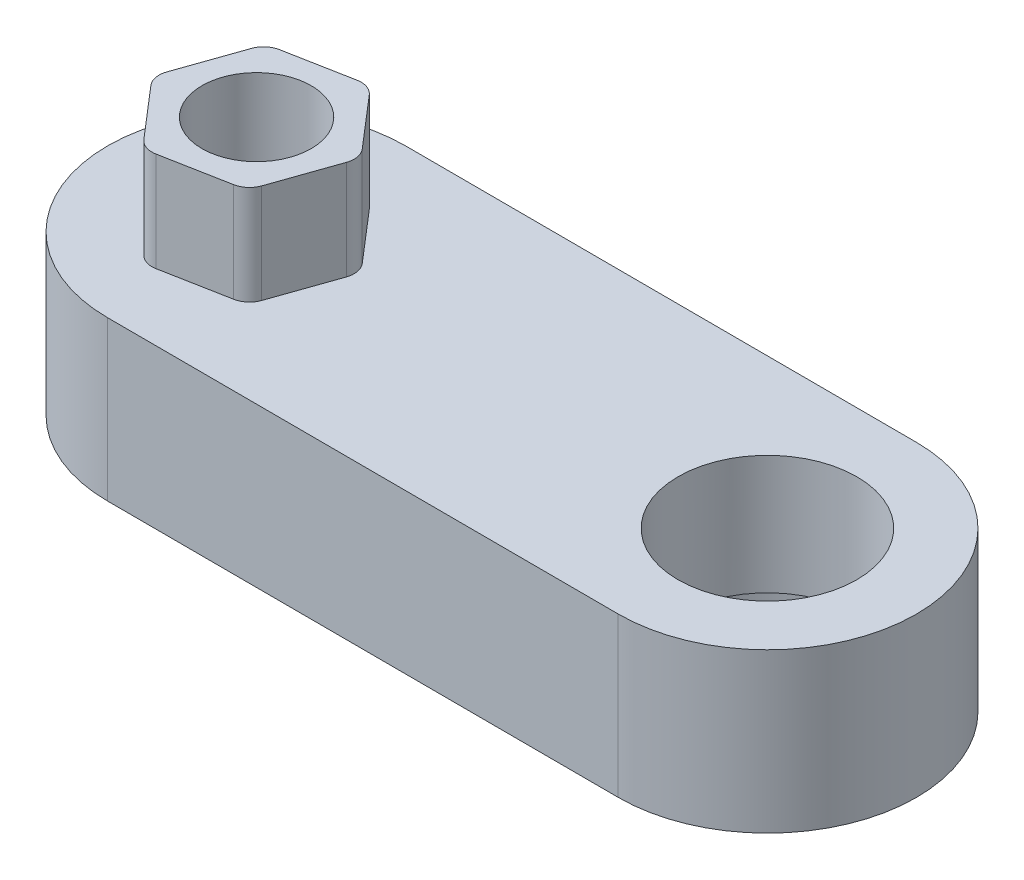
ISO-10303-21;
HEADER;
FILE_DESCRIPTION(('STEP AP214'),'2;1');
FILE_NAME('part.step','',(''),(''),'','','');
FILE_SCHEMA(('AUTOMOTIVE_DESIGN { 1 0 10303 214 1 1 1 1 }'));
ENDSEC;
DATA;
#1=APPLICATION_CONTEXT('core data for automotive mechanical design processes');
#2=APPLICATION_PROTOCOL_DEFINITION('international standard','automotive_design',2000,#1);
#3=PRODUCT_CONTEXT('',#1,'mechanical');
#4=PRODUCT('Part','Part','',(#3));
#5=PRODUCT_RELATED_PRODUCT_CATEGORY('part','',(#4));
#6=PRODUCT_DEFINITION_FORMATION('','',#4);
#7=PRODUCT_DEFINITION_CONTEXT('part definition',#1,'design');
#8=PRODUCT_DEFINITION('design','',#6,#7);
#9=PRODUCT_DEFINITION_SHAPE('','',#8);
#10=(LENGTH_UNIT() NAMED_UNIT(*) SI_UNIT(.MILLI.,.METRE.));
#11=(NAMED_UNIT(*) PLANE_ANGLE_UNIT() SI_UNIT($,.RADIAN.));
#12=(NAMED_UNIT(*) SI_UNIT($,.STERADIAN.) SOLID_ANGLE_UNIT());
#13=UNCERTAINTY_MEASURE_WITH_UNIT(LENGTH_MEASURE(1.E-05),#10,'distance_accuracy_value','');
#14=(GEOMETRIC_REPRESENTATION_CONTEXT(3) GLOBAL_UNCERTAINTY_ASSIGNED_CONTEXT((#13)) GLOBAL_UNIT_ASSIGNED_CONTEXT((#10,
#11,#12)) REPRESENTATION_CONTEXT('',''));
#15=CARTESIAN_POINT('',(0.,0.,0.));
#16=DIRECTION('',(0.,0.,1.));
#17=DIRECTION('',(1.,0.,0.));
#18=AXIS2_PLACEMENT_3D('',#15,#16,#17);
#19=CARTESIAN_POINT('',(-1.76310548074214,0.,-3.41650348242183));
#20=DIRECTION('',(0.,1.,0.));
#21=DIRECTION('',(0.,0.,1.));
#22=AXIS2_PLACEMENT_3D('',#19,#20,#21);
#23=CYLINDRICAL_SURFACE('',#22,2.75);
#24=CARTESIAN_POINT('',(-1.76310548074214,13.,-3.41650348242183));
#25=DIRECTION('',(0.,1.,0.));
#26=DIRECTION('',(0.,0.,1.));
#27=AXIS2_PLACEMENT_3D('',#24,#25,#26);
#28=CIRCLE('',#27,2.75);
#29=CARTESIAN_POINT('',(-1.76310548074214,13.,-0.666503482421826));
#30=VERTEX_POINT('',#29);
#31=EDGE_CURVE('E325',#30,#30,#28,.T.);
#32=ORIENTED_EDGE('',*,*,#31,.T.);
#33=EDGE_LOOP('',(#32));
#34=FACE_BOUND('',#33,.T.);
#35=CARTESIAN_POINT('',(-1.76310548074214,3.,-3.41650348242183));
#36=DIRECTION('',(0.,-1.,0.));
#37=DIRECTION('',(0.,0.,-1.));
#38=AXIS2_PLACEMENT_3D('',#35,#36,#37);
#39=CIRCLE('',#38,2.75);
#40=CARTESIAN_POINT('',(-1.76310548074214,3.,-6.16650348242183));
#41=VERTEX_POINT('',#40);
#42=EDGE_CURVE('E37',#41,#41,#39,.F.);
#43=ORIENTED_EDGE('',*,*,#42,.F.);
#44=EDGE_LOOP('',(#43));
#45=FACE_BOUND('',#44,.T.);
#46=ADVANCED_FACE('F33',(#34,#45),#23,.F.);
#47=CARTESIAN_POINT('',(24.0348577490154,8.,-3.35037386801913));
#48=DIRECTION('',(0.,1.,0.));
#49=DIRECTION('',(0.,0.,1.));
#50=AXIS2_PLACEMENT_3D('',#47,#48,#49);
#51=PLANE('',#50);
#52=CARTESIAN_POINT('',(24.0348577490154,8.,-3.35037386801913));
#53=DIRECTION('',(0.,1.,0.));
#54=DIRECTION('',(0.,0.,1.));
#55=AXIS2_PLACEMENT_3D('',#52,#53,#54);
#56=CIRCLE('',#55,4.5);
#57=CARTESIAN_POINT('',(24.0348577490154,8.,1.14962613198087));
#58=VERTEX_POINT('',#57);
#59=EDGE_CURVE('E756',#58,#58,#56,.T.);
#60=ORIENTED_EDGE('',*,*,#59,.F.);
#61=EDGE_LOOP('',(#60));
#62=FACE_BOUND('',#61,.T.);
#63=CARTESIAN_POINT('',(24.0348577490154,8.,-3.35037386801913));
#64=DIRECTION('',(0.,1.,0.));
#65=DIRECTION('',(0.,0.,1.));
#66=AXIS2_PLACEMENT_3D('',#63,#64,#65);
#67=CIRCLE('',#66,7.5);
#68=CARTESIAN_POINT('',(24.0156325693323,8.,4.1496014914381));
#69=VERTEX_POINT('',#68);
#70=CARTESIAN_POINT('',(24.0540829286985,8.,-10.8503492274764));
#71=VERTEX_POINT('',#70);
#72=EDGE_CURVE('E364',#69,#71,#67,.T.);
#73=ORIENTED_EDGE('',*,*,#72,.T.);
#74=DIRECTION('',(-0.999996714594302,0.,-0.00256335729108146));
#75=VECTOR('',#74,1.);
#76=CARTESIAN_POINT('',(24.0540829286985,8.,-10.8503492274764));
#77=LINE('',#76,#75);
#78=CARTESIAN_POINT('',(-1.74388030105903,8.,-10.9164788418791));
#79=VERTEX_POINT('',#78);
#80=EDGE_CURVE('E367',#71,#79,#77,.T.);
#81=ORIENTED_EDGE('',*,*,#80,.T.);
#82=CARTESIAN_POINT('',(-1.76310548074214,8.,-3.41650348242183));
#83=DIRECTION('',(0.,1.,0.));
#84=DIRECTION('',(0.,0.,1.));
#85=AXIS2_PLACEMENT_3D('',#82,#83,#84);
#86=CIRCLE('',#85,7.5);
#87=CARTESIAN_POINT('',(-1.78233066042525,8.,4.08347187703544));
#88=VERTEX_POINT('',#87);
#89=EDGE_CURVE('E370',#79,#88,#86,.T.);
#90=ORIENTED_EDGE('',*,*,#89,.T.);
#91=DIRECTION('',(0.999996714594302,0.,0.00256335729108162));
#92=VECTOR('',#91,1.);
#93=CARTESIAN_POINT('',(24.0156325693323,8.,4.1496014914381));
#94=LINE('',#93,#92);
#95=EDGE_CURVE('E372',#88,#69,#94,.T.);
#96=ORIENTED_EDGE('',*,*,#95,.T.);
#97=EDGE_LOOP('',(#73,#81,#90,#96));
#98=FACE_BOUND('',#97,.T.);
#99=DIRECTION('',(0.98262288242802,0.,-0.185613229401487));
#100=VECTOR('',#99,1.);
#101=CARTESIAN_POINT('',(-3.25175247023499,8.,0.833664766091873));
#102=LINE('',#101,#100);
#103=CARTESIAN_POINT('',(-2.68443488455328,8.,0.726500918131768));
#104=VERTEX_POINT('',#103);
#105=CARTESIAN_POINT('',(0.606007112400627,8.,0.104950599963159));
#106=VERTEX_POINT('',#105);
#107=EDGE_CURVE('E351',#104,#106,#102,.T.);
#108=ORIENTED_EDGE('',*,*,#107,.F.);
#109=CARTESIAN_POINT('',(-2.87004811395477,8.,-0.256121964296252));
#110=DIRECTION('',(0.,1.,0.));
#111=DIRECTION('',(0.,0.,1.));
#112=AXIS2_PLACEMENT_3D('',#109,#110,#111);
#113=CIRCLE('',#112,1.);
#114=CARTESIAN_POINT('',(-3.62821787777658,8.,0.39593524885791));
#115=VERTEX_POINT('',#114);
#116=EDGE_CURVE('E42',#104,#115,#113,.F.);
#117=ORIENTED_EDGE('',*,*,#116,.T.);
#118=DIRECTION('',(0.652057213154162,0.,0.758169763821816));
#119=VECTOR('',#118,1.);
#120=CARTESIAN_POINT('',(-6.18818264905945,8.,-2.58062546833306));
#121=LINE('',#120,#119);
#122=CARTESIAN_POINT('',(-5.81171724151786,8.,-2.1428959510991));
#123=VERTEX_POINT('',#122);
#124=EDGE_CURVE('E328',#123,#115,#121,.T.);
#125=ORIENTED_EDGE('',*,*,#124,.F.);
#126=CARTESIAN_POINT('',(-5.05354747769604,8.,-2.79495316425326));
#127=DIRECTION('',(0.,1.,0.));
#128=DIRECTION('',(0.,0.,1.));
#129=AXIS2_PLACEMENT_3D('',#126,#127,#128);
#130=CIRCLE('',#129,1.);
#131=CARTESIAN_POINT('',(-5.99733047091934,8.,-3.12551883352712));
#132=VERTEX_POINT('',#131);
#133=EDGE_CURVE('E441',#123,#132,#130,.F.);
#134=ORIENTED_EDGE('',*,*,#133,.T.);
#135=DIRECTION('',(-0.330565669273856,0.,0.943782993223298));
#136=VECTOR('',#135,1.);
#137=CARTESIAN_POINT('',(-4.6995356595666,8.,-6.83079371684673));
#138=LINE('',#137,#136);
#139=CARTESIAN_POINT('',(-4.89038783770671,8.,-6.28590035165267));
#140=VERTEX_POINT('',#139);
#141=EDGE_CURVE('E333',#140,#132,#138,.T.);
#142=ORIENTED_EDGE('',*,*,#141,.F.);
#143=CARTESIAN_POINT('',(-3.94660484448341,8.,-5.95533468237882));
#144=DIRECTION('',(0.,1.,0.));
#145=DIRECTION('',(0.,0.,1.));
#146=AXIS2_PLACEMENT_3D('',#143,#144,#145);
#147=CIRCLE('',#146,1.);
#148=CARTESIAN_POINT('',(-4.13221807388489,8.,-6.93795756480684));
#149=VERTEX_POINT('',#148);
#150=EDGE_CURVE('E435',#140,#149,#147,.F.);
#151=ORIENTED_EDGE('',*,*,#150,.T.);
#152=DIRECTION('',(-0.982622882428021,0.,0.185613229401483));
#153=VECTOR('',#152,1.);
#154=CARTESIAN_POINT('',(-0.274458491249265,8.,-7.66667173093554));
#155=LINE('',#154,#153);
#156=CARTESIAN_POINT('',(-0.841776076930966,8.,-7.55950788297544));
#157=VERTEX_POINT('',#156);
#158=EDGE_CURVE('E359',#157,#149,#155,.T.);
#159=ORIENTED_EDGE('',*,*,#158,.F.);
#160=CARTESIAN_POINT('',(-0.656162847529482,8.,-6.57688500054742));
#161=DIRECTION('',(0.,1.,0.));
#162=DIRECTION('',(0.,0.,1.));
#163=AXIS2_PLACEMENT_3D('',#160,#161,#162);
#164=CIRCLE('',#163,1.);
#165=CARTESIAN_POINT('',(0.102006916292328,8.,-7.22894221370158));
#166=VERTEX_POINT('',#165);
#167=EDGE_CURVE('E437',#157,#166,#164,.F.);
#168=ORIENTED_EDGE('',*,*,#167,.T.);
#169=DIRECTION('',(-0.652057213154167,0.,-0.758169763821811));
#170=VECTOR('',#169,1.);
#171=CARTESIAN_POINT('',(2.66197168757519,8.,-4.25238149651066));
#172=LINE('',#171,#170);
#173=CARTESIAN_POINT('',(2.2855062800336,8.,-4.69011101374462));
#174=VERTEX_POINT('',#173);
#175=EDGE_CURVE('E356',#174,#166,#172,.T.);
#176=ORIENTED_EDGE('',*,*,#175,.F.);
#177=CARTESIAN_POINT('',(1.52733651621178,8.,-4.03805380059045));
#178=DIRECTION('',(0.,1.,0.));
#179=DIRECTION('',(0.,0.,1.));
#180=AXIS2_PLACEMENT_3D('',#177,#178,#179);
#181=CIRCLE('',#180,1.);
#182=CARTESIAN_POINT('',(2.47111950943508,8.,-3.70748813131659));
#183=VERTEX_POINT('',#182);
#184=EDGE_CURVE('E439',#174,#183,#181,.F.);
#185=ORIENTED_EDGE('',*,*,#184,.T.);
#186=DIRECTION('',(0.330565669273855,0.,-0.943782993223298));
#187=VECTOR('',#186,1.);
#188=CARTESIAN_POINT('',(1.17332469808233,8.,-0.00221324799694478));
#189=LINE('',#188,#187);
#190=CARTESIAN_POINT('',(1.36417687622244,8.,-0.547106613191006));
#191=VERTEX_POINT('',#190);
#192=EDGE_CURVE('E353',#191,#183,#189,.T.);
#193=ORIENTED_EDGE('',*,*,#192,.F.);
#194=CARTESIAN_POINT('',(0.420393882999141,8.,-0.877672282464861));
#195=DIRECTION('',(0.,1.,0.));
#196=DIRECTION('',(0.,0.,1.));
#197=AXIS2_PLACEMENT_3D('',#194,#195,#196);
#198=CIRCLE('',#197,1.);
#199=EDGE_CURVE('E11',#191,#106,#198,.F.);
#200=ORIENTED_EDGE('',*,*,#199,.T.);
#201=EDGE_LOOP('',(#108,#117,#125,#134,#142,#151,#159,#168,#176,#185,#193,#200));
#202=FACE_BOUND('',#201,.T.);
#203=ADVANCED_FACE('F444',(#62,#98,#202),#51,.T.);
#204=CARTESIAN_POINT('',(24.0348577490154,8.,-3.35037386801913));
#205=DIRECTION('',(0.,-1.,0.));
#206=DIRECTION('',(0.,0.,-1.));
#207=AXIS2_PLACEMENT_3D('',#204,#205,#206);
#208=CYLINDRICAL_SURFACE('',#207,7.5);
#209=CARTESIAN_POINT('',(24.0348577490154,0.,-3.35037386801913));
#210=DIRECTION('',(0.,1.,0.));
#211=DIRECTION('',(0.,0.,1.));
#212=AXIS2_PLACEMENT_3D('',#209,#210,#211);
#213=CIRCLE('',#212,7.5);
#214=CARTESIAN_POINT('',(24.0156325693323,0.,4.1496014914381));
#215=VERTEX_POINT('',#214);
#216=CARTESIAN_POINT('',(24.0540829286985,0.,-10.8503492274764));
#217=VERTEX_POINT('',#216);
#218=EDGE_CURVE('E348',#215,#217,#213,.T.);
#219=ORIENTED_EDGE('',*,*,#218,.T.);
#220=DIRECTION('',(0.,-1.,0.));
#221=VECTOR('',#220,1.);
#222=CARTESIAN_POINT('',(24.0540829286985,8.,-10.8503492274764));
#223=LINE('',#222,#221);
#224=EDGE_CURVE('E390',#71,#217,#223,.T.);
#225=ORIENTED_EDGE('',*,*,#224,.F.);
#226=ORIENTED_EDGE('',*,*,#72,.F.);
#227=DIRECTION('',(0.,-1.,0.));
#228=VECTOR('',#227,1.);
#229=CARTESIAN_POINT('',(24.0156325693323,8.,4.1496014914381));
#230=LINE('',#229,#228);
#231=EDGE_CURVE('E374',#69,#215,#230,.T.);
#232=ORIENTED_EDGE('',*,*,#231,.T.);
#233=EDGE_LOOP('',(#219,#225,#226,#232));
#234=FACE_BOUND('',#233,.T.);
#235=ADVANCED_FACE('F510',(#234),#208,.T.);
#236=CARTESIAN_POINT('',(24.0540829286985,8.,-10.8503492274764));
#237=DIRECTION('',(-0.00256335729108146,0.,0.999996714594302));
#238=DIRECTION('',(0.999996714594302,0.,0.00256335729108146));
#239=AXIS2_PLACEMENT_3D('',#236,#237,#238);
#240=PLANE('',#239);
#241=DIRECTION('',(-0.999996714594302,0.,-0.00256335729108146));
#242=VECTOR('',#241,1.);
#243=CARTESIAN_POINT('',(24.0540829286985,0.,-10.8503492274764));
#244=LINE('',#243,#242);
#245=CARTESIAN_POINT('',(-1.74388030105903,0.,-10.9164788418791));
#246=VERTEX_POINT('',#245);
#247=EDGE_CURVE('E377',#217,#246,#244,.T.);
#248=ORIENTED_EDGE('',*,*,#247,.T.);
#249=DIRECTION('',(0.,-1.,0.));
#250=VECTOR('',#249,1.);
#251=CARTESIAN_POINT('',(-1.74388030105903,8.,-10.9164788418791));
#252=LINE('',#251,#250);
#253=EDGE_CURVE('E387',#79,#246,#252,.T.);
#254=ORIENTED_EDGE('',*,*,#253,.F.);
#255=ORIENTED_EDGE('',*,*,#80,.F.);
#256=ORIENTED_EDGE('',*,*,#224,.T.);
#257=EDGE_LOOP('',(#248,#254,#255,#256));
#258=FACE_BOUND('',#257,.T.);
#259=ADVANCED_FACE('F543',(#258),#240,.F.);
#260=CARTESIAN_POINT('',(-1.76310548074214,8.,-3.41650348242183));
#261=DIRECTION('',(0.,-1.,0.));
#262=DIRECTION('',(0.,0.,-1.));
#263=AXIS2_PLACEMENT_3D('',#260,#261,#262);
#264=CYLINDRICAL_SURFACE('',#263,7.5);
#265=CARTESIAN_POINT('',(-1.76310548074214,0.,-3.41650348242183));
#266=DIRECTION('',(0.,1.,0.));
#267=DIRECTION('',(0.,0.,1.));
#268=AXIS2_PLACEMENT_3D('',#265,#266,#267);
#269=CIRCLE('',#268,7.5);
#270=CARTESIAN_POINT('',(-1.78233066042525,0.,4.08347187703544));
#271=VERTEX_POINT('',#270);
#272=EDGE_CURVE('E379',#246,#271,#269,.T.);
#273=ORIENTED_EDGE('',*,*,#272,.T.);
#274=DIRECTION('',(0.,-1.,0.));
#275=VECTOR('',#274,1.);
#276=CARTESIAN_POINT('',(-1.78233066042525,8.,4.08347187703544));
#277=LINE('',#276,#275);
#278=EDGE_CURVE('E384',#88,#271,#277,.T.);
#279=ORIENTED_EDGE('',*,*,#278,.F.);
#280=ORIENTED_EDGE('',*,*,#89,.F.);
#281=ORIENTED_EDGE('',*,*,#253,.T.);
#282=EDGE_LOOP('',(#273,#279,#280,#281));
#283=FACE_BOUND('',#282,.T.);
#284=ADVANCED_FACE('F539',(#283),#264,.T.);
#285=CARTESIAN_POINT('',(24.0156325693323,8.,4.1496014914381));
#286=DIRECTION('',(0.00256335729108163,0.,-0.999996714594302));
#287=DIRECTION('',(-0.999996714594302,0.,-0.00256335729108163));
#288=AXIS2_PLACEMENT_3D('',#285,#286,#287);
#289=PLANE('',#288);
#290=DIRECTION('',(0.999996714594302,0.,0.00256335729108162));
#291=VECTOR('',#290,1.);
#292=CARTESIAN_POINT('',(24.0156325693323,0.,4.1496014914381));
#293=LINE('',#292,#291);
#294=EDGE_CURVE('E368',#271,#215,#293,.T.);
#295=ORIENTED_EDGE('',*,*,#294,.T.);
#296=ORIENTED_EDGE('',*,*,#231,.F.);
#297=ORIENTED_EDGE('',*,*,#95,.F.);
#298=ORIENTED_EDGE('',*,*,#278,.T.);
#299=EDGE_LOOP('',(#295,#296,#297,#298));
#300=FACE_BOUND('',#299,.T.);
#301=ADVANCED_FACE('F535',(#300),#289,.F.);
#302=CARTESIAN_POINT('',(24.0348577490154,0.,-3.35037386801913));
#303=DIRECTION('',(0.,1.,0.));
#304=DIRECTION('',(0.,0.,1.));
#305=AXIS2_PLACEMENT_3D('',#302,#303,#304);
#306=PLANE('',#305);
#307=CARTESIAN_POINT('',(24.0348577490154,0.,-3.35037386801913));
#308=DIRECTION('',(0.,-1.,0.));
#309=DIRECTION('',(0.,0.,-1.));
#310=AXIS2_PLACEMENT_3D('',#307,#308,#309);
#311=CIRCLE('',#310,6.59999999999999);
#312=CARTESIAN_POINT('',(24.0348577490154,0.,-9.95037386801913));
#313=VERTEX_POINT('',#312);
#314=EDGE_CURVE('E246',#313,#313,#311,.T.);
#315=ORIENTED_EDGE('',*,*,#314,.F.);
#316=EDGE_LOOP('',(#315));
#317=FACE_BOUND('',#316,.T.);
#318=DIRECTION('',(-0.98262288242802,0.,0.185613229401487));
#319=VECTOR('',#318,1.);
#320=CARTESIAN_POINT('',(0.698813727101371,0.,0.596262041177169));
#321=LINE('',#320,#319);
#322=CARTESIAN_POINT('',(0.698813727101372,0.,0.59626204117717));
#323=VERTEX_POINT('',#322);
#324=CARTESIAN_POINT('',(-2.59162826985254,0.,1.21781235934578));
#325=VERTEX_POINT('',#324);
#326=EDGE_CURVE('E275',#323,#325,#321,.T.);
#327=ORIENTED_EDGE('',*,*,#326,.F.);
#328=CARTESIAN_POINT('',(0.420393882999141,0.,-0.877672282464861));
#329=DIRECTION('',(0.,-1.,0.));
#330=DIRECTION('',(0.,0.,-1.));
#331=AXIS2_PLACEMENT_3D('',#328,#329,#330);
#332=CIRCLE('',#331,1.5);
#333=CARTESIAN_POINT('',(1.83606837283409,0.,-0.381823778554079));
#334=VERTEX_POINT('',#333);
#335=EDGE_CURVE('E49',#334,#323,#332,.T.);
#336=ORIENTED_EDGE('',*,*,#335,.F.);
#337=DIRECTION('',(-0.330565669273855,0.,0.943782993223298));
#338=VECTOR('',#337,1.);
#339=CARTESIAN_POINT('',(2.94301100604673,0.,-3.54220529667967));
#340=LINE('',#339,#338);
#341=CARTESIAN_POINT('',(2.94301100604673,0.,-3.54220529667967));
#342=VERTEX_POINT('',#341);
#343=EDGE_CURVE('E240',#342,#334,#340,.T.);
#344=ORIENTED_EDGE('',*,*,#343,.F.);
#345=CARTESIAN_POINT('',(1.52733651621178,0.,-4.03805380059045));
#346=DIRECTION('',(0.,-1.,0.));
#347=DIRECTION('',(0.,0.,-1.));
#348=AXIS2_PLACEMENT_3D('',#345,#346,#347);
#349=CIRCLE('',#348,1.5);
#350=CARTESIAN_POINT('',(2.6645911619445,0.,-5.0161396203217));
#351=VERTEX_POINT('',#350);
#352=EDGE_CURVE('E243',#351,#342,#349,.T.);
#353=ORIENTED_EDGE('',*,*,#352,.F.);
#354=DIRECTION('',(0.652057213154167,0.,0.758169763821811));
#355=VECTOR('',#354,1.);
#356=CARTESIAN_POINT('',(0.481091798203234,0.,-7.55497082027867));
#357=LINE('',#356,#355);
#358=CARTESIAN_POINT('',(0.481091798203234,0.,-7.55497082027867));
#359=VERTEX_POINT('',#358);
#360=EDGE_CURVE('E299',#359,#351,#357,.T.);
#361=ORIENTED_EDGE('',*,*,#360,.F.);
#362=CARTESIAN_POINT('',(-0.656162847529482,0.,-6.57688500054742));
#363=DIRECTION('',(0.,-1.,0.));
#364=DIRECTION('',(0.,0.,-1.));
#365=AXIS2_PLACEMENT_3D('',#362,#363,#364);
#366=CIRCLE('',#365,1.5);
#367=CARTESIAN_POINT('',(-0.934582691631707,0.,-8.05081932418945));
#368=VERTEX_POINT('',#367);
#369=EDGE_CURVE('E296',#368,#359,#366,.T.);
#370=ORIENTED_EDGE('',*,*,#369,.F.);
#371=DIRECTION('',(0.982622882428021,0.,-0.185613229401483));
#372=VECTOR('',#371,1.);
#373=CARTESIAN_POINT('',(-4.22502468858564,0.,-7.42926900602085));
#374=LINE('',#373,#372);
#375=CARTESIAN_POINT('',(-4.22502468858564,0.,-7.42926900602085));
#376=VERTEX_POINT('',#375);
#377=EDGE_CURVE('E293',#376,#368,#374,.T.);
#378=ORIENTED_EDGE('',*,*,#377,.F.);
#379=CARTESIAN_POINT('',(-3.94660484448341,0.,-5.95533468237882));
#380=DIRECTION('',(0.,-1.,0.));
#381=DIRECTION('',(0.,0.,-1.));
#382=AXIS2_PLACEMENT_3D('',#379,#380,#381);
#383=CIRCLE('',#382,1.5);
#384=CARTESIAN_POINT('',(-5.36227933431836,0.,-6.4511831862896));
#385=VERTEX_POINT('',#384);
#386=EDGE_CURVE('E290',#385,#376,#383,.T.);
#387=ORIENTED_EDGE('',*,*,#386,.F.);
#388=DIRECTION('',(0.330565669273856,0.,-0.943782993223298));
#389=VECTOR('',#388,1.);
#390=CARTESIAN_POINT('',(-6.46922196753099,0.,-3.29080166816405));
#391=LINE('',#390,#389);
#392=CARTESIAN_POINT('',(-6.46922196753099,0.,-3.29080166816405));
#393=VERTEX_POINT('',#392);
#394=EDGE_CURVE('E287',#393,#385,#391,.T.);
#395=ORIENTED_EDGE('',*,*,#394,.F.);
#396=CARTESIAN_POINT('',(-5.05354747769604,0.,-2.79495316425326));
#397=DIRECTION('',(0.,-1.,0.));
#398=DIRECTION('',(0.,0.,-1.));
#399=AXIS2_PLACEMENT_3D('',#396,#397,#398);
#400=CIRCLE('',#399,1.5);
#401=CARTESIAN_POINT('',(-6.19080212342877,0.,-1.81686734452202));
#402=VERTEX_POINT('',#401);
#403=EDGE_CURVE('E284',#402,#393,#400,.T.);
#404=ORIENTED_EDGE('',*,*,#403,.F.);
#405=DIRECTION('',(-0.652057213154162,0.,-0.758169763821816));
#406=VECTOR('',#405,1.);
#407=CARTESIAN_POINT('',(-4.00730275968749,0.,0.72196385543499));
#408=LINE('',#407,#406);
#409=CARTESIAN_POINT('',(-4.00730275968749,0.,0.72196385543499));
#410=VERTEX_POINT('',#409);
#411=EDGE_CURVE('E281',#410,#402,#408,.T.);
#412=ORIENTED_EDGE('',*,*,#411,.F.);
#413=CARTESIAN_POINT('',(-2.87004811395477,0.,-0.256121964296252));
#414=DIRECTION('',(0.,-1.,0.));
#415=DIRECTION('',(0.,0.,-1.));
#416=AXIS2_PLACEMENT_3D('',#413,#414,#415);
#417=CIRCLE('',#416,1.5);
#418=EDGE_CURVE('E278',#325,#410,#417,.T.);
#419=ORIENTED_EDGE('',*,*,#418,.F.);
#420=EDGE_LOOP('',(#327,#336,#344,#353,#361,#370,#378,#387,#395,#404,#412,#419));
#421=FACE_BOUND('',#420,.T.);
#422=ORIENTED_EDGE('',*,*,#218,.F.);
#423=ORIENTED_EDGE('',*,*,#294,.F.);
#424=ORIENTED_EDGE('',*,*,#272,.F.);
#425=ORIENTED_EDGE('',*,*,#247,.F.);
#426=EDGE_LOOP('',(#422,#423,#424,#425));
#427=FACE_BOUND('',#426,.T.);
#428=ADVANCED_FACE('F531',(#317,#421,#427),#306,.F.);
#429=CARTESIAN_POINT('',(-6.18818264905945,13.,-2.58062546833306));
#430=DIRECTION('',(0.758169763821816,0.,-0.652057213154162));
#431=DIRECTION('',(-0.652057213154162,0.,-0.758169763821816));
#432=AXIS2_PLACEMENT_3D('',#429,#430,#431);
#433=PLANE('',#432);
#434=DIRECTION('',(0.652057213154162,0.,0.758169763821816));
#435=VECTOR('',#434,1.);
#436=CARTESIAN_POINT('',(-6.18818264905945,13.,-2.58062546833306));
#437=LINE('',#436,#435);
#438=CARTESIAN_POINT('',(-5.81171724151786,13.,-2.1428959510991));
#439=VERTEX_POINT('',#438);
#440=CARTESIAN_POINT('',(-3.62821787777658,13.,0.39593524885791));
#441=VERTEX_POINT('',#440);
#442=EDGE_CURVE('E329',#439,#441,#437,.T.);
#443=ORIENTED_EDGE('',*,*,#442,.F.);
#444=DIRECTION('',(0.,-1.,0.));
#445=VECTOR('',#444,1.);
#446=CARTESIAN_POINT('',(-5.81171724151786,13.,-2.1428959510991));
#447=LINE('',#446,#445);
#448=EDGE_CURVE('E427',#439,#123,#447,.T.);
#449=ORIENTED_EDGE('',*,*,#448,.T.);
#450=ORIENTED_EDGE('',*,*,#124,.T.);
#451=DIRECTION('',(0.,-1.,0.));
#452=VECTOR('',#451,1.);
#453=CARTESIAN_POINT('',(-3.62821787777658,13.,0.39593524885791));
#454=LINE('',#453,#452);
#455=EDGE_CURVE('E425',#115,#441,#454,.F.);
#456=ORIENTED_EDGE('',*,*,#455,.T.);
#457=EDGE_LOOP('',(#443,#449,#450,#456));
#458=FACE_BOUND('',#457,.T.);
#459=ADVANCED_FACE('F450',(#458),#433,.F.);
#460=CARTESIAN_POINT('',(-3.25175247023499,13.,0.833664766091873));
#461=DIRECTION('',(-0.185613229401487,0.,-0.98262288242802));
#462=DIRECTION('',(-0.98262288242802,0.,0.185613229401487));
#463=AXIS2_PLACEMENT_3D('',#460,#461,#462);
#464=PLANE('',#463);
#465=DIRECTION('',(0.98262288242802,0.,-0.185613229401487));
#466=VECTOR('',#465,1.);
#467=CARTESIAN_POINT('',(-3.25175247023499,13.,0.833664766091873));
#468=LINE('',#467,#466);
#469=CARTESIAN_POINT('',(-2.68443488455328,13.,0.726500918131768));
#470=VERTEX_POINT('',#469);
#471=CARTESIAN_POINT('',(0.606007112400627,13.,0.104950599963159));
#472=VERTEX_POINT('',#471);
#473=EDGE_CURVE('E332',#470,#472,#468,.T.);
#474=ORIENTED_EDGE('',*,*,#473,.F.);
#475=DIRECTION('',(0.,-1.,0.));
#476=VECTOR('',#475,1.);
#477=CARTESIAN_POINT('',(-2.68443488455328,13.,0.726500918131768));
#478=LINE('',#477,#476);
#479=EDGE_CURVE('E432',#470,#104,#478,.T.);
#480=ORIENTED_EDGE('',*,*,#479,.T.);
#481=ORIENTED_EDGE('',*,*,#107,.T.);
#482=DIRECTION('',(0.,-1.,0.));
#483=VECTOR('',#482,1.);
#484=CARTESIAN_POINT('',(0.606007112400627,13.,0.104950599963159));
#485=LINE('',#484,#483);
#486=EDGE_CURVE('E430',#106,#472,#485,.F.);
#487=ORIENTED_EDGE('',*,*,#486,.T.);
#488=EDGE_LOOP('',(#474,#480,#481,#487));
#489=FACE_BOUND('',#488,.T.);
#490=ADVANCED_FACE('F459',(#489),#464,.F.);
#491=CARTESIAN_POINT('',(1.17332469808233,13.,-0.00221324799694478));
#492=DIRECTION('',(-0.943782993223298,0.,-0.330565669273855));
#493=DIRECTION('',(-0.330565669273855,0.,0.943782993223298));
#494=AXIS2_PLACEMENT_3D('',#491,#492,#493);
#495=PLANE('',#494);
#496=ORIENTED_EDGE('',*,*,#192,.T.);
#497=DIRECTION('',(0.,-1.,0.));
#498=VECTOR('',#497,1.);
#499=CARTESIAN_POINT('',(2.47111950943508,13.,-3.70748813131659));
#500=LINE('',#499,#498);
#501=CARTESIAN_POINT('',(2.47111950943508,13.,-3.70748813131659));
#502=VERTEX_POINT('',#501);
#503=EDGE_CURVE('E423',#183,#502,#500,.F.);
#504=ORIENTED_EDGE('',*,*,#503,.T.);
#505=DIRECTION('',(0.330565669273855,0.,-0.943782993223298));
#506=VECTOR('',#505,1.);
#507=CARTESIAN_POINT('',(1.17332469808233,13.,-0.00221324799694478));
#508=LINE('',#507,#506);
#509=CARTESIAN_POINT('',(1.36417687622244,13.,-0.547106613191006));
#510=VERTEX_POINT('',#509);
#511=EDGE_CURVE('E336',#510,#502,#508,.T.);
#512=ORIENTED_EDGE('',*,*,#511,.F.);
#513=DIRECTION('',(0.,-1.,0.));
#514=VECTOR('',#513,1.);
#515=CARTESIAN_POINT('',(1.36417687622244,13.,-0.547106613191006));
#516=LINE('',#515,#514);
#517=EDGE_CURVE('E420',#510,#191,#516,.T.);
#518=ORIENTED_EDGE('',*,*,#517,.T.);
#519=EDGE_LOOP('',(#496,#504,#512,#518));
#520=FACE_BOUND('',#519,.T.);
#521=ADVANCED_FACE('F466',(#520),#495,.F.);
#522=CARTESIAN_POINT('',(2.66197168757519,13.,-4.25238149651066));
#523=DIRECTION('',(-0.758169763821811,0.,0.652057213154167));
#524=DIRECTION('',(0.652057213154167,0.,0.758169763821811));
#525=AXIS2_PLACEMENT_3D('',#522,#523,#524);
#526=PLANE('',#525);
#527=ORIENTED_EDGE('',*,*,#175,.T.);
#528=DIRECTION('',(0.,-1.,0.));
#529=VECTOR('',#528,1.);
#530=CARTESIAN_POINT('',(0.102006916292329,13.,-7.22894221370158));
#531=LINE('',#530,#529);
#532=CARTESIAN_POINT('',(0.102006916292328,13.,-7.22894221370158));
#533=VERTEX_POINT('',#532);
#534=EDGE_CURVE('E418',#166,#533,#531,.F.);
#535=ORIENTED_EDGE('',*,*,#534,.T.);
#536=DIRECTION('',(-0.652057213154167,0.,-0.758169763821811));
#537=VECTOR('',#536,1.);
#538=CARTESIAN_POINT('',(2.66197168757519,13.,-4.25238149651066));
#539=LINE('',#538,#537);
#540=CARTESIAN_POINT('',(2.2855062800336,13.,-4.69011101374462));
#541=VERTEX_POINT('',#540);
#542=EDGE_CURVE('E339',#541,#533,#539,.T.);
#543=ORIENTED_EDGE('',*,*,#542,.F.);
#544=DIRECTION('',(0.,-1.,0.));
#545=VECTOR('',#544,1.);
#546=CARTESIAN_POINT('',(2.2855062800336,13.,-4.69011101374462));
#547=LINE('',#546,#545);
#548=EDGE_CURVE('E415',#541,#174,#547,.T.);
#549=ORIENTED_EDGE('',*,*,#548,.T.);
#550=EDGE_LOOP('',(#527,#535,#543,#549));
#551=FACE_BOUND('',#550,.T.);
#552=ADVANCED_FACE('F474',(#551),#526,.F.);
#553=CARTESIAN_POINT('',(-0.274458491249265,13.,-7.66667173093554));
#554=DIRECTION('',(0.185613229401483,0.,0.982622882428021));
#555=DIRECTION('',(0.982622882428021,0.,-0.185613229401483));
#556=AXIS2_PLACEMENT_3D('',#553,#554,#555);
#557=PLANE('',#556);
#558=ORIENTED_EDGE('',*,*,#158,.T.);
#559=DIRECTION('',(0.,-1.,0.));
#560=VECTOR('',#559,1.);
#561=CARTESIAN_POINT('',(-4.13221807388489,13.,-6.93795756480684));
#562=LINE('',#561,#560);
#563=CARTESIAN_POINT('',(-4.13221807388489,13.,-6.93795756480684));
#564=VERTEX_POINT('',#563);
#565=EDGE_CURVE('E401',#149,#564,#562,.F.);
#566=ORIENTED_EDGE('',*,*,#565,.T.);
#567=DIRECTION('',(-0.982622882428021,0.,0.185613229401483));
#568=VECTOR('',#567,1.);
#569=CARTESIAN_POINT('',(-0.274458491249265,13.,-7.66667173093554));
#570=LINE('',#569,#568);
#571=CARTESIAN_POINT('',(-0.841776076930966,13.,-7.55950788297544));
#572=VERTEX_POINT('',#571);
#573=EDGE_CURVE('E342',#572,#564,#570,.T.);
#574=ORIENTED_EDGE('',*,*,#573,.F.);
#575=DIRECTION('',(0.,-1.,0.));
#576=VECTOR('',#575,1.);
#577=CARTESIAN_POINT('',(-0.841776076930966,13.,-7.55950788297544));
#578=LINE('',#577,#576);
#579=EDGE_CURVE('E398',#572,#157,#578,.T.);
#580=ORIENTED_EDGE('',*,*,#579,.T.);
#581=EDGE_LOOP('',(#558,#566,#574,#580));
#582=FACE_BOUND('',#581,.T.);
#583=ADVANCED_FACE('F483',(#582),#557,.F.);
#584=CARTESIAN_POINT('',(-4.6995356595666,13.,-6.83079371684673));
#585=DIRECTION('',(0.943782993223298,0.,0.330565669273856));
#586=DIRECTION('',(0.330565669273856,0.,-0.943782993223298));
#587=AXIS2_PLACEMENT_3D('',#584,#585,#586);
#588=PLANE('',#587);
#589=DIRECTION('',(-0.330565669273856,0.,0.943782993223298));
#590=VECTOR('',#589,1.);
#591=CARTESIAN_POINT('',(-4.6995356595666,13.,-6.83079371684673));
#592=LINE('',#591,#590);
#593=CARTESIAN_POINT('',(-4.89038783770671,13.,-6.28590035165267));
#594=VERTEX_POINT('',#593);
#595=CARTESIAN_POINT('',(-5.99733047091934,13.,-3.12551883352712));
#596=VERTEX_POINT('',#595);
#597=EDGE_CURVE('E345',#594,#596,#592,.T.);
#598=ORIENTED_EDGE('',*,*,#597,.F.);
#599=DIRECTION('',(0.,-1.,0.));
#600=VECTOR('',#599,1.);
#601=CARTESIAN_POINT('',(-4.89038783770671,13.,-6.28590035165267));
#602=LINE('',#601,#600);
#603=EDGE_CURVE('E395',#594,#140,#602,.T.);
#604=ORIENTED_EDGE('',*,*,#603,.T.);
#605=ORIENTED_EDGE('',*,*,#141,.T.);
#606=DIRECTION('',(0.,-1.,0.));
#607=VECTOR('',#606,1.);
#608=CARTESIAN_POINT('',(-5.99733047091934,13.,-3.12551883352712));
#609=LINE('',#608,#607);
#610=EDGE_CURVE('E393',#132,#596,#609,.F.);
#611=ORIENTED_EDGE('',*,*,#610,.T.);
#612=EDGE_LOOP('',(#598,#604,#605,#611));
#613=FACE_BOUND('',#612,.T.);
#614=ADVANCED_FACE('F492',(#613),#588,.F.);
#615=CARTESIAN_POINT('',(0.,13.,0.));
#616=DIRECTION('',(0.,1.,0.));
#617=DIRECTION('',(0.,0.,1.));
#618=AXIS2_PLACEMENT_3D('',#615,#616,#617);
#619=PLANE('',#618);
#620=ORIENTED_EDGE('',*,*,#31,.F.);
#621=EDGE_LOOP('',(#620));
#622=FACE_BOUND('',#621,.T.);
#623=ORIENTED_EDGE('',*,*,#573,.T.);
#624=CARTESIAN_POINT('',(-3.94660484448341,13.,-5.95533468237882));
#625=DIRECTION('',(0.,1.,0.));
#626=DIRECTION('',(0.,0.,1.));
#627=AXIS2_PLACEMENT_3D('',#624,#625,#626);
#628=CIRCLE('',#627,1.);
#629=EDGE_CURVE('E413',#564,#594,#628,.T.);
#630=ORIENTED_EDGE('',*,*,#629,.T.);
#631=ORIENTED_EDGE('',*,*,#597,.T.);
#632=CARTESIAN_POINT('',(-5.05354747769604,13.,-2.79495316425326));
#633=DIRECTION('',(0.,1.,0.));
#634=DIRECTION('',(0.,0.,1.));
#635=AXIS2_PLACEMENT_3D('',#632,#633,#634);
#636=CIRCLE('',#635,1.);
#637=EDGE_CURVE('E407',#596,#439,#636,.T.);
#638=ORIENTED_EDGE('',*,*,#637,.T.);
#639=ORIENTED_EDGE('',*,*,#442,.T.);
#640=CARTESIAN_POINT('',(-2.87004811395477,13.,-0.256121964296252));
#641=DIRECTION('',(0.,1.,0.));
#642=DIRECTION('',(0.,0.,1.));
#643=AXIS2_PLACEMENT_3D('',#640,#641,#642);
#644=CIRCLE('',#643,1.);
#645=EDGE_CURVE('E405',#441,#470,#644,.T.);
#646=ORIENTED_EDGE('',*,*,#645,.T.);
#647=ORIENTED_EDGE('',*,*,#473,.T.);
#648=CARTESIAN_POINT('',(0.420393882999141,13.,-0.877672282464861));
#649=DIRECTION('',(0.,1.,0.));
#650=DIRECTION('',(0.,0.,1.));
#651=AXIS2_PLACEMENT_3D('',#648,#649,#650);
#652=CIRCLE('',#651,1.);
#653=EDGE_CURVE('E403',#472,#510,#652,.T.);
#654=ORIENTED_EDGE('',*,*,#653,.T.);
#655=ORIENTED_EDGE('',*,*,#511,.T.);
#656=CARTESIAN_POINT('',(1.52733651621178,13.,-4.03805380059045));
#657=DIRECTION('',(0.,1.,0.));
#658=DIRECTION('',(0.,0.,1.));
#659=AXIS2_PLACEMENT_3D('',#656,#657,#658);
#660=CIRCLE('',#659,1.);
#661=EDGE_CURVE('E409',#502,#541,#660,.T.);
#662=ORIENTED_EDGE('',*,*,#661,.T.);
#663=ORIENTED_EDGE('',*,*,#542,.T.);
#664=CARTESIAN_POINT('',(-0.656162847529482,13.,-6.57688500054742));
#665=DIRECTION('',(0.,1.,0.));
#666=DIRECTION('',(0.,0.,1.));
#667=AXIS2_PLACEMENT_3D('',#664,#665,#666);
#668=CIRCLE('',#667,1.);
#669=EDGE_CURVE('E411',#533,#572,#668,.T.);
#670=ORIENTED_EDGE('',*,*,#669,.T.);
#671=EDGE_LOOP('',(#623,#630,#631,#638,#639,#646,#647,#654,#655,#662,#663,#670));
#672=FACE_BOUND('',#671,.T.);
#673=ADVANCED_FACE('F456',(#622,#672),#619,.T.);
#674=CARTESIAN_POINT('',(-3.94660484448341,13.,-5.95533468237882));
#675=DIRECTION('',(0.,-1.,0.));
#676=DIRECTION('',(0.,0.,-1.));
#677=AXIS2_PLACEMENT_3D('',#674,#675,#676);
#678=CYLINDRICAL_SURFACE('',#677,1.);
#679=ORIENTED_EDGE('',*,*,#629,.F.);
#680=ORIENTED_EDGE('',*,*,#565,.F.);
#681=ORIENTED_EDGE('',*,*,#150,.F.);
#682=ORIENTED_EDGE('',*,*,#603,.F.);
#683=EDGE_LOOP('',(#679,#680,#681,#682));
#684=FACE_BOUND('',#683,.T.);
#685=ADVANCED_FACE('F487',(#684),#678,.T.);
#686=CARTESIAN_POINT('',(-0.656162847529482,13.,-6.57688500054742));
#687=DIRECTION('',(0.,-1.,0.));
#688=DIRECTION('',(0.,0.,-1.));
#689=AXIS2_PLACEMENT_3D('',#686,#687,#688);
#690=CYLINDRICAL_SURFACE('',#689,1.);
#691=ORIENTED_EDGE('',*,*,#669,.F.);
#692=ORIENTED_EDGE('',*,*,#534,.F.);
#693=ORIENTED_EDGE('',*,*,#167,.F.);
#694=ORIENTED_EDGE('',*,*,#579,.F.);
#695=EDGE_LOOP('',(#691,#692,#693,#694));
#696=FACE_BOUND('',#695,.T.);
#697=ADVANCED_FACE('F478',(#696),#690,.T.);
#698=CARTESIAN_POINT('',(1.52733651621178,13.,-4.03805380059045));
#699=DIRECTION('',(0.,-1.,0.));
#700=DIRECTION('',(0.,0.,-1.));
#701=AXIS2_PLACEMENT_3D('',#698,#699,#700);
#702=CYLINDRICAL_SURFACE('',#701,1.);
#703=ORIENTED_EDGE('',*,*,#661,.F.);
#704=ORIENTED_EDGE('',*,*,#503,.F.);
#705=ORIENTED_EDGE('',*,*,#184,.F.);
#706=ORIENTED_EDGE('',*,*,#548,.F.);
#707=EDGE_LOOP('',(#703,#704,#705,#706));
#708=FACE_BOUND('',#707,.T.);
#709=ADVANCED_FACE('F469',(#708),#702,.T.);
#710=CARTESIAN_POINT('',(-5.05354747769604,13.,-2.79495316425326));
#711=DIRECTION('',(0.,-1.,0.));
#712=DIRECTION('',(0.,0.,-1.));
#713=AXIS2_PLACEMENT_3D('',#710,#711,#712);
#714=CYLINDRICAL_SURFACE('',#713,1.);
#715=ORIENTED_EDGE('',*,*,#637,.F.);
#716=ORIENTED_EDGE('',*,*,#610,.F.);
#717=ORIENTED_EDGE('',*,*,#133,.F.);
#718=ORIENTED_EDGE('',*,*,#448,.F.);
#719=EDGE_LOOP('',(#715,#716,#717,#718));
#720=FACE_BOUND('',#719,.T.);
#721=ADVANCED_FACE('F496',(#720),#714,.T.);
#722=CARTESIAN_POINT('',(-2.87004811395477,13.,-0.256121964296252));
#723=DIRECTION('',(0.,-1.,0.));
#724=DIRECTION('',(0.,0.,-1.));
#725=AXIS2_PLACEMENT_3D('',#722,#723,#724);
#726=CYLINDRICAL_SURFACE('',#725,1.);
#727=ORIENTED_EDGE('',*,*,#645,.F.);
#728=ORIENTED_EDGE('',*,*,#455,.F.);
#729=ORIENTED_EDGE('',*,*,#116,.F.);
#730=ORIENTED_EDGE('',*,*,#479,.F.);
#731=EDGE_LOOP('',(#727,#728,#729,#730));
#732=FACE_BOUND('',#731,.T.);
#733=ADVANCED_FACE('F453',(#732),#726,.T.);
#734=CARTESIAN_POINT('',(0.420393882999141,13.,-0.877672282464861));
#735=DIRECTION('',(0.,-1.,0.));
#736=DIRECTION('',(0.,0.,-1.));
#737=AXIS2_PLACEMENT_3D('',#734,#735,#736);
#738=CYLINDRICAL_SURFACE('',#737,1.);
#739=ORIENTED_EDGE('',*,*,#653,.F.);
#740=ORIENTED_EDGE('',*,*,#486,.F.);
#741=ORIENTED_EDGE('',*,*,#199,.F.);
#742=ORIENTED_EDGE('',*,*,#517,.F.);
#743=EDGE_LOOP('',(#739,#740,#741,#742));
#744=FACE_BOUND('',#743,.T.);
#745=ADVANCED_FACE('F35',(#744),#738,.T.);
#746=CARTESIAN_POINT('',(0.420393882999141,3.,-0.877672282464861));
#747=DIRECTION('',(0.,-1.,0.));
#748=DIRECTION('',(0.,0.,-1.));
#749=AXIS2_PLACEMENT_3D('',#746,#747,#748);
#750=PLANE('',#749);
#751=CARTESIAN_POINT('',(0.420393882999141,3.,-0.877672282464861));
#752=DIRECTION('',(0.,-1.,0.));
#753=DIRECTION('',(0.,0.,-1.));
#754=AXIS2_PLACEMENT_3D('',#751,#752,#753);
#755=CIRCLE('',#754,1.5);
#756=CARTESIAN_POINT('',(1.83606837283409,3.,-0.381823778554079));
#757=VERTEX_POINT('',#756);
#758=CARTESIAN_POINT('',(0.698813727101371,3.,0.596262041177169));
#759=VERTEX_POINT('',#758);
#760=EDGE_CURVE('E220',#757,#759,#755,.T.);
#761=ORIENTED_EDGE('',*,*,#760,.T.);
#762=DIRECTION('',(-0.98262288242802,0.,0.185613229401487));
#763=VECTOR('',#762,1.);
#764=CARTESIAN_POINT('',(0.698813727101371,3.,0.596262041177169));
#765=LINE('',#764,#763);
#766=CARTESIAN_POINT('',(-2.59162826985254,3.,1.21781235934578));
#767=VERTEX_POINT('',#766);
#768=EDGE_CURVE('E229',#759,#767,#765,.T.);
#769=ORIENTED_EDGE('',*,*,#768,.T.);
#770=CARTESIAN_POINT('',(-2.87004811395477,3.,-0.256121964296252));
#771=DIRECTION('',(0.,-1.,0.));
#772=DIRECTION('',(0.,0.,-1.));
#773=AXIS2_PLACEMENT_3D('',#770,#771,#772);
#774=CIRCLE('',#773,1.5);
#775=CARTESIAN_POINT('',(-4.00730275968749,3.,0.72196385543499));
#776=VERTEX_POINT('',#775);
#777=EDGE_CURVE('E234',#767,#776,#774,.T.);
#778=ORIENTED_EDGE('',*,*,#777,.T.);
#779=DIRECTION('',(-0.652057213154162,0.,-0.758169763821816));
#780=VECTOR('',#779,1.);
#781=CARTESIAN_POINT('',(-4.00730275968749,3.,0.72196385543499));
#782=LINE('',#781,#780);
#783=CARTESIAN_POINT('',(-6.19080212342877,3.,-1.81686734452202));
#784=VERTEX_POINT('',#783);
#785=EDGE_CURVE('E250',#776,#784,#782,.T.);
#786=ORIENTED_EDGE('',*,*,#785,.T.);
#787=CARTESIAN_POINT('',(-5.05354747769604,3.,-2.79495316425326));
#788=DIRECTION('',(0.,-1.,0.));
#789=DIRECTION('',(0.,0.,-1.));
#790=AXIS2_PLACEMENT_3D('',#787,#788,#789);
#791=CIRCLE('',#790,1.5);
#792=CARTESIAN_POINT('',(-6.46922196753099,3.,-3.29080166816405));
#793=VERTEX_POINT('',#792);
#794=EDGE_CURVE('E253',#784,#793,#791,.T.);
#795=ORIENTED_EDGE('',*,*,#794,.T.);
#796=DIRECTION('',(0.330565669273856,0.,-0.943782993223298));
#797=VECTOR('',#796,1.);
#798=CARTESIAN_POINT('',(-6.46922196753099,3.,-3.29080166816405));
#799=LINE('',#798,#797);
#800=CARTESIAN_POINT('',(-5.36227933431836,3.,-6.4511831862896));
#801=VERTEX_POINT('',#800);
#802=EDGE_CURVE('E256',#793,#801,#799,.T.);
#803=ORIENTED_EDGE('',*,*,#802,.T.);
#804=CARTESIAN_POINT('',(-3.94660484448341,3.,-5.95533468237882));
#805=DIRECTION('',(0.,-1.,0.));
#806=DIRECTION('',(0.,0.,-1.));
#807=AXIS2_PLACEMENT_3D('',#804,#805,#806);
#808=CIRCLE('',#807,1.5);
#809=CARTESIAN_POINT('',(-4.22502468858564,3.,-7.42926900602085));
#810=VERTEX_POINT('',#809);
#811=EDGE_CURVE('E259',#801,#810,#808,.T.);
#812=ORIENTED_EDGE('',*,*,#811,.T.);
#813=DIRECTION('',(0.982622882428021,0.,-0.185613229401483));
#814=VECTOR('',#813,1.);
#815=CARTESIAN_POINT('',(-4.22502468858564,3.,-7.42926900602085));
#816=LINE('',#815,#814);
#817=CARTESIAN_POINT('',(-0.934582691631707,3.,-8.05081932418945));
#818=VERTEX_POINT('',#817);
#819=EDGE_CURVE('E262',#810,#818,#816,.T.);
#820=ORIENTED_EDGE('',*,*,#819,.T.);
#821=CARTESIAN_POINT('',(-0.656162847529482,3.,-6.57688500054742));
#822=DIRECTION('',(0.,-1.,0.));
#823=DIRECTION('',(0.,0.,-1.));
#824=AXIS2_PLACEMENT_3D('',#821,#822,#823);
#825=CIRCLE('',#824,1.5);
#826=CARTESIAN_POINT('',(0.481091798203234,3.,-7.55497082027867));
#827=VERTEX_POINT('',#826);
#828=EDGE_CURVE('E265',#818,#827,#825,.T.);
#829=ORIENTED_EDGE('',*,*,#828,.T.);
#830=DIRECTION('',(0.652057213154167,0.,0.758169763821811));
#831=VECTOR('',#830,1.);
#832=CARTESIAN_POINT('',(0.481091798203234,3.,-7.55497082027867));
#833=LINE('',#832,#831);
#834=CARTESIAN_POINT('',(2.6645911619445,3.,-5.0161396203217));
#835=VERTEX_POINT('',#834);
#836=EDGE_CURVE('E268',#827,#835,#833,.T.);
#837=ORIENTED_EDGE('',*,*,#836,.T.);
#838=CARTESIAN_POINT('',(1.52733651621178,3.,-4.03805380059045));
#839=DIRECTION('',(0.,-1.,0.));
#840=DIRECTION('',(0.,0.,-1.));
#841=AXIS2_PLACEMENT_3D('',#838,#839,#840);
#842=CIRCLE('',#841,1.5);
#843=CARTESIAN_POINT('',(2.94301100604673,3.,-3.54220529667967));
#844=VERTEX_POINT('',#843);
#845=EDGE_CURVE('E271',#835,#844,#842,.T.);
#846=ORIENTED_EDGE('',*,*,#845,.T.);
#847=DIRECTION('',(-0.330565669273855,0.,0.943782993223298));
#848=VECTOR('',#847,1.);
#849=CARTESIAN_POINT('',(2.94301100604673,3.,-3.54220529667967));
#850=LINE('',#849,#848);
#851=EDGE_CURVE('E226',#844,#757,#850,.T.);
#852=ORIENTED_EDGE('',*,*,#851,.T.);
#853=EDGE_LOOP('',(#761,#769,#778,#786,#795,#803,#812,#820,#829,#837,#846,#852));
#854=FACE_BOUND('',#853,.T.);
#855=ORIENTED_EDGE('',*,*,#42,.T.);
#856=EDGE_LOOP('',(#855));
#857=FACE_BOUND('',#856,.T.);
#858=ADVANCED_FACE('F236',(#854,#857),#750,.T.);
#859=CARTESIAN_POINT('',(0.420393882999141,3.,-0.877672282464861));
#860=DIRECTION('',(0.,-1.,0.));
#861=DIRECTION('',(0.,0.,-1.));
#862=AXIS2_PLACEMENT_3D('',#859,#860,#861);
#863=CYLINDRICAL_SURFACE('',#862,1.5);
#864=ORIENTED_EDGE('',*,*,#335,.T.);
#865=DIRECTION('',(0.,-1.,0.));
#866=VECTOR('',#865,1.);
#867=CARTESIAN_POINT('',(0.698813727101371,3.,0.596262041177169));
#868=LINE('',#867,#866);
#869=EDGE_CURVE('E216',#759,#323,#868,.T.);
#870=ORIENTED_EDGE('',*,*,#869,.F.);
#871=ORIENTED_EDGE('',*,*,#760,.F.);
#872=DIRECTION('',(0.,-1.,0.));
#873=VECTOR('',#872,1.);
#874=CARTESIAN_POINT('',(1.83606837283409,3.,-0.381823778554079));
#875=LINE('',#874,#873);
#876=EDGE_CURVE('E304',#757,#334,#875,.T.);
#877=ORIENTED_EDGE('',*,*,#876,.T.);
#878=EDGE_LOOP('',(#864,#870,#871,#877));
#879=FACE_BOUND('',#878,.T.);
#880=ADVANCED_FACE('F218',(#879),#863,.F.);
#881=CARTESIAN_POINT('',(2.94301100604673,3.,-3.54220529667967));
#882=DIRECTION('',(0.943782993223298,0.,0.330565669273855));
#883=DIRECTION('',(0.330565669273855,0.,-0.943782993223298));
#884=AXIS2_PLACEMENT_3D('',#881,#882,#883);
#885=PLANE('',#884);
#886=ORIENTED_EDGE('',*,*,#343,.T.);
#887=ORIENTED_EDGE('',*,*,#876,.F.);
#888=ORIENTED_EDGE('',*,*,#851,.F.);
#889=DIRECTION('',(0.,-1.,0.));
#890=VECTOR('',#889,1.);
#891=CARTESIAN_POINT('',(2.94301100604673,3.,-3.54220529667967));
#892=LINE('',#891,#890);
#893=EDGE_CURVE('E306',#844,#342,#892,.T.);
#894=ORIENTED_EDGE('',*,*,#893,.T.);
#895=EDGE_LOOP('',(#886,#887,#888,#894));
#896=FACE_BOUND('',#895,.T.);
#897=ADVANCED_FACE('F600',(#896),#885,.F.);
#898=CARTESIAN_POINT('',(1.52733651621178,3.,-4.03805380059045));
#899=DIRECTION('',(0.,-1.,0.));
#900=DIRECTION('',(0.,0.,-1.));
#901=AXIS2_PLACEMENT_3D('',#898,#899,#900);
#902=CYLINDRICAL_SURFACE('',#901,1.5);
#903=ORIENTED_EDGE('',*,*,#352,.T.);
#904=ORIENTED_EDGE('',*,*,#893,.F.);
#905=ORIENTED_EDGE('',*,*,#845,.F.);
#906=DIRECTION('',(0.,-1.,0.));
#907=VECTOR('',#906,1.);
#908=CARTESIAN_POINT('',(2.6645911619445,3.,-5.0161396203217));
#909=LINE('',#908,#907);
#910=EDGE_CURVE('E308',#835,#351,#909,.T.);
#911=ORIENTED_EDGE('',*,*,#910,.T.);
#912=EDGE_LOOP('',(#903,#904,#905,#911));
#913=FACE_BOUND('',#912,.T.);
#914=ADVANCED_FACE('F608',(#913),#902,.F.);
#915=CARTESIAN_POINT('',(0.481091798203234,3.,-7.55497082027867));
#916=DIRECTION('',(0.758169763821811,0.,-0.652057213154167));
#917=DIRECTION('',(-0.652057213154167,0.,-0.758169763821811));
#918=AXIS2_PLACEMENT_3D('',#915,#916,#917);
#919=PLANE('',#918);
#920=ORIENTED_EDGE('',*,*,#360,.T.);
#921=ORIENTED_EDGE('',*,*,#910,.F.);
#922=ORIENTED_EDGE('',*,*,#836,.F.);
#923=DIRECTION('',(0.,-1.,0.));
#924=VECTOR('',#923,1.);
#925=CARTESIAN_POINT('',(0.481091798203234,3.,-7.55497082027867));
#926=LINE('',#925,#924);
#927=EDGE_CURVE('E310',#827,#359,#926,.T.);
#928=ORIENTED_EDGE('',*,*,#927,.T.);
#929=EDGE_LOOP('',(#920,#921,#922,#928));
#930=FACE_BOUND('',#929,.T.);
#931=ADVANCED_FACE('F618',(#930),#919,.F.);
#932=CARTESIAN_POINT('',(-0.656162847529482,3.,-6.57688500054742));
#933=DIRECTION('',(0.,-1.,0.));
#934=DIRECTION('',(0.,0.,-1.));
#935=AXIS2_PLACEMENT_3D('',#932,#933,#934);
#936=CYLINDRICAL_SURFACE('',#935,1.5);
#937=ORIENTED_EDGE('',*,*,#369,.T.);
#938=ORIENTED_EDGE('',*,*,#927,.F.);
#939=ORIENTED_EDGE('',*,*,#828,.F.);
#940=DIRECTION('',(0.,-1.,0.));
#941=VECTOR('',#940,1.);
#942=CARTESIAN_POINT('',(-0.934582691631707,3.,-8.05081932418945));
#943=LINE('',#942,#941);
#944=EDGE_CURVE('E312',#818,#368,#943,.T.);
#945=ORIENTED_EDGE('',*,*,#944,.T.);
#946=EDGE_LOOP('',(#937,#938,#939,#945));
#947=FACE_BOUND('',#946,.T.);
#948=ADVANCED_FACE('F628',(#947),#936,.F.);
#949=CARTESIAN_POINT('',(-4.22502468858564,3.,-7.42926900602085));
#950=DIRECTION('',(-0.185613229401483,0.,-0.982622882428021));
#951=DIRECTION('',(-0.982622882428021,0.,0.185613229401483));
#952=AXIS2_PLACEMENT_3D('',#949,#950,#951);
#953=PLANE('',#952);
#954=ORIENTED_EDGE('',*,*,#377,.T.);
#955=ORIENTED_EDGE('',*,*,#944,.F.);
#956=ORIENTED_EDGE('',*,*,#819,.F.);
#957=DIRECTION('',(0.,-1.,0.));
#958=VECTOR('',#957,1.);
#959=CARTESIAN_POINT('',(-4.22502468858564,3.,-7.42926900602085));
#960=LINE('',#959,#958);
#961=EDGE_CURVE('E314',#810,#376,#960,.T.);
#962=ORIENTED_EDGE('',*,*,#961,.T.);
#963=EDGE_LOOP('',(#954,#955,#956,#962));
#964=FACE_BOUND('',#963,.T.);
#965=ADVANCED_FACE('F638',(#964),#953,.F.);
#966=CARTESIAN_POINT('',(-3.94660484448341,3.,-5.95533468237882));
#967=DIRECTION('',(0.,-1.,0.));
#968=DIRECTION('',(0.,0.,-1.));
#969=AXIS2_PLACEMENT_3D('',#966,#967,#968);
#970=CYLINDRICAL_SURFACE('',#969,1.5);
#971=ORIENTED_EDGE('',*,*,#386,.T.);
#972=ORIENTED_EDGE('',*,*,#961,.F.);
#973=ORIENTED_EDGE('',*,*,#811,.F.);
#974=DIRECTION('',(0.,-1.,0.));
#975=VECTOR('',#974,1.);
#976=CARTESIAN_POINT('',(-5.36227933431836,3.,-6.4511831862896));
#977=LINE('',#976,#975);
#978=EDGE_CURVE('E316',#801,#385,#977,.T.);
#979=ORIENTED_EDGE('',*,*,#978,.T.);
#980=EDGE_LOOP('',(#971,#972,#973,#979));
#981=FACE_BOUND('',#980,.T.);
#982=ADVANCED_FACE('F648',(#981),#970,.F.);
#983=CARTESIAN_POINT('',(-6.46922196753099,3.,-3.29080166816405));
#984=DIRECTION('',(-0.943782993223298,0.,-0.330565669273856));
#985=DIRECTION('',(-0.330565669273856,0.,0.943782993223298));
#986=AXIS2_PLACEMENT_3D('',#983,#984,#985);
#987=PLANE('',#986);
#988=ORIENTED_EDGE('',*,*,#394,.T.);
#989=ORIENTED_EDGE('',*,*,#978,.F.);
#990=ORIENTED_EDGE('',*,*,#802,.F.);
#991=DIRECTION('',(0.,-1.,0.));
#992=VECTOR('',#991,1.);
#993=CARTESIAN_POINT('',(-6.46922196753099,3.,-3.29080166816405));
#994=LINE('',#993,#992);
#995=EDGE_CURVE('E318',#793,#393,#994,.T.);
#996=ORIENTED_EDGE('',*,*,#995,.T.);
#997=EDGE_LOOP('',(#988,#989,#990,#996));
#998=FACE_BOUND('',#997,.T.);
#999=ADVANCED_FACE('F658',(#998),#987,.F.);
#1000=CARTESIAN_POINT('',(-5.05354747769604,3.,-2.79495316425326));
#1001=DIRECTION('',(0.,-1.,0.));
#1002=DIRECTION('',(0.,0.,-1.));
#1003=AXIS2_PLACEMENT_3D('',#1000,#1001,#1002);
#1004=CYLINDRICAL_SURFACE('',#1003,1.5);
#1005=ORIENTED_EDGE('',*,*,#403,.T.);
#1006=ORIENTED_EDGE('',*,*,#995,.F.);
#1007=ORIENTED_EDGE('',*,*,#794,.F.);
#1008=DIRECTION('',(0.,-1.,0.));
#1009=VECTOR('',#1008,1.);
#1010=CARTESIAN_POINT('',(-6.19080212342877,3.,-1.81686734452202));
#1011=LINE('',#1010,#1009);
#1012=EDGE_CURVE('E320',#784,#402,#1011,.T.);
#1013=ORIENTED_EDGE('',*,*,#1012,.T.);
#1014=EDGE_LOOP('',(#1005,#1006,#1007,#1013));
#1015=FACE_BOUND('',#1014,.T.);
#1016=ADVANCED_FACE('F668',(#1015),#1004,.F.);
#1017=CARTESIAN_POINT('',(-4.00730275968749,3.,0.72196385543499));
#1018=DIRECTION('',(-0.758169763821816,0.,0.652057213154162));
#1019=DIRECTION('',(0.652057213154162,0.,0.758169763821816));
#1020=AXIS2_PLACEMENT_3D('',#1017,#1018,#1019);
#1021=PLANE('',#1020);
#1022=ORIENTED_EDGE('',*,*,#411,.T.);
#1023=ORIENTED_EDGE('',*,*,#1012,.F.);
#1024=ORIENTED_EDGE('',*,*,#785,.F.);
#1025=DIRECTION('',(0.,-1.,0.));
#1026=VECTOR('',#1025,1.);
#1027=CARTESIAN_POINT('',(-4.00730275968749,3.,0.72196385543499));
#1028=LINE('',#1027,#1026);
#1029=EDGE_CURVE('E322',#776,#410,#1028,.T.);
#1030=ORIENTED_EDGE('',*,*,#1029,.T.);
#1031=EDGE_LOOP('',(#1022,#1023,#1024,#1030));
#1032=FACE_BOUND('',#1031,.T.);
#1033=ADVANCED_FACE('F678',(#1032),#1021,.F.);
#1034=CARTESIAN_POINT('',(-2.87004811395477,3.,-0.256121964296252));
#1035=DIRECTION('',(0.,-1.,0.));
#1036=DIRECTION('',(0.,0.,-1.));
#1037=AXIS2_PLACEMENT_3D('',#1034,#1035,#1036);
#1038=CYLINDRICAL_SURFACE('',#1037,1.5);
#1039=ORIENTED_EDGE('',*,*,#418,.T.);
#1040=ORIENTED_EDGE('',*,*,#1029,.F.);
#1041=ORIENTED_EDGE('',*,*,#777,.F.);
#1042=DIRECTION('',(0.,-1.,0.));
#1043=VECTOR('',#1042,1.);
#1044=CARTESIAN_POINT('',(-2.59162826985254,3.,1.21781235934578));
#1045=LINE('',#1044,#1043);
#1046=EDGE_CURVE('E225',#767,#325,#1045,.T.);
#1047=ORIENTED_EDGE('',*,*,#1046,.T.);
#1048=EDGE_LOOP('',(#1039,#1040,#1041,#1047));
#1049=FACE_BOUND('',#1048,.T.);
#1050=ADVANCED_FACE('F688',(#1049),#1038,.F.);
#1051=CARTESIAN_POINT('',(0.698813727101371,3.,0.596262041177169));
#1052=DIRECTION('',(0.185613229401487,0.,0.98262288242802));
#1053=DIRECTION('',(0.98262288242802,0.,-0.185613229401487));
#1054=AXIS2_PLACEMENT_3D('',#1051,#1052,#1053);
#1055=PLANE('',#1054);
#1056=ORIENTED_EDGE('',*,*,#326,.T.);
#1057=ORIENTED_EDGE('',*,*,#1046,.F.);
#1058=ORIENTED_EDGE('',*,*,#768,.F.);
#1059=ORIENTED_EDGE('',*,*,#869,.T.);
#1060=EDGE_LOOP('',(#1056,#1057,#1058,#1059));
#1061=FACE_BOUND('',#1060,.T.);
#1062=ADVANCED_FACE('F230',(#1061),#1055,.F.);
#1063=CARTESIAN_POINT('',(24.0348577490154,2.,-3.35037386801913));
#1064=DIRECTION('',(0.,-1.,0.));
#1065=DIRECTION('',(0.,0.,-1.));
#1066=AXIS2_PLACEMENT_3D('',#1063,#1064,#1065);
#1067=CYLINDRICAL_SURFACE('',#1066,6.59999999999999);
#1068=CARTESIAN_POINT('',(24.0348577490154,2.,-3.35037386801913));
#1069=DIRECTION('',(0.,-1.,0.));
#1070=DIRECTION('',(0.,0.,-1.));
#1071=AXIS2_PLACEMENT_3D('',#1068,#1069,#1070);
#1072=CIRCLE('',#1071,6.59999999999999);
#1073=CARTESIAN_POINT('',(24.0348577490154,2.,-9.95037386801913));
#1074=VERTEX_POINT('',#1073);
#1075=EDGE_CURVE('E276',#1074,#1074,#1072,.T.);
#1076=ORIENTED_EDGE('',*,*,#1075,.F.);
#1077=EDGE_LOOP('',(#1076));
#1078=FACE_BOUND('',#1077,.T.);
#1079=ORIENTED_EDGE('',*,*,#314,.T.);
#1080=EDGE_LOOP('',(#1079));
#1081=FACE_BOUND('',#1080,.T.);
#1082=ADVANCED_FACE('F707',(#1078,#1081),#1067,.F.);
#1083=CARTESIAN_POINT('',(24.0348577490154,2.,-3.35037386801913));
#1084=DIRECTION('',(0.,-1.,0.));
#1085=DIRECTION('',(0.,0.,-1.));
#1086=AXIS2_PLACEMENT_3D('',#1083,#1084,#1085);
#1087=PLANE('',#1086);
#1088=CARTESIAN_POINT('',(24.0348577490154,2.,-3.35037386801913));
#1089=DIRECTION('',(0.,-1.,0.));
#1090=DIRECTION('',(0.,0.,-1.));
#1091=AXIS2_PLACEMENT_3D('',#1088,#1089,#1090);
#1092=CIRCLE('',#1091,4.5);
#1093=CARTESIAN_POINT('',(24.0348577490154,2.,-7.85037386801913));
#1094=VERTEX_POINT('',#1093);
#1095=EDGE_CURVE('E759',#1094,#1094,#1092,.T.);
#1096=ORIENTED_EDGE('',*,*,#1095,.F.);
#1097=EDGE_LOOP('',(#1096));
#1098=FACE_BOUND('',#1097,.T.);
#1099=ORIENTED_EDGE('',*,*,#1075,.T.);
#1100=EDGE_LOOP('',(#1099));
#1101=FACE_BOUND('',#1100,.T.);
#1102=ADVANCED_FACE('F723',(#1098,#1101),#1087,.T.);
#1103=CARTESIAN_POINT('',(24.0348577490154,13.,-3.35037386801913));
#1104=DIRECTION('',(0.,-1.,0.));
#1105=DIRECTION('',(0.,0.,-1.));
#1106=AXIS2_PLACEMENT_3D('',#1103,#1104,#1105);
#1107=CYLINDRICAL_SURFACE('',#1106,4.5);
#1108=ORIENTED_EDGE('',*,*,#59,.T.);
#1109=EDGE_LOOP('',(#1108));
#1110=FACE_BOUND('',#1109,.T.);
#1111=ORIENTED_EDGE('',*,*,#1095,.T.);
#1112=EDGE_LOOP('',(#1111));
#1113=FACE_BOUND('',#1112,.T.);
#1114=ADVANCED_FACE('F739',(#1110,#1113),#1107,.F.);
#1115=CLOSED_SHELL('',(#46,#203,#235,#259,#284,#301,#428,#459,#490,#521,#552,#583,#614,#673,
#685,#697,#709,#721,#733,#745,#858,#880,#897,#914,#931,#948,#965,#982,#999,#1016,#1033,#1050,
#1062,#1082,#1102,#1114));
#1116=MANIFOLD_SOLID_BREP('B2',#1115);
#1117=ADVANCED_BREP_SHAPE_REPRESENTATION('',(#18,#1116),#14);
#1118=SHAPE_DEFINITION_REPRESENTATION(#9,#1117);
ENDSEC;
END-ISO-10303-21;
